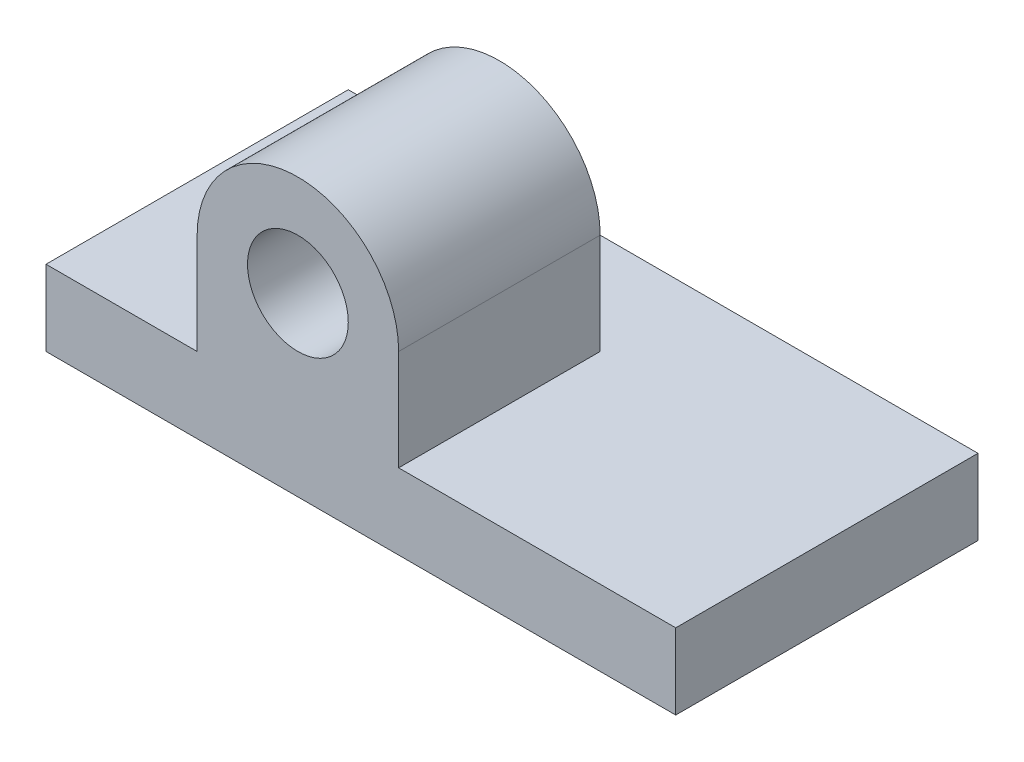
ISO-10303-21;
HEADER;
FILE_DESCRIPTION(('STEP AP214'),'2;1');
FILE_NAME('part.step','',(''),(''),'','','');
FILE_SCHEMA(('AUTOMOTIVE_DESIGN { 1 0 10303 214 1 1 1 1 }'));
ENDSEC;
DATA;
#1=APPLICATION_CONTEXT('core data for automotive mechanical design processes');
#2=APPLICATION_PROTOCOL_DEFINITION('international standard','automotive_design',2000,#1);
#3=PRODUCT_CONTEXT('',#1,'mechanical');
#4=PRODUCT('Part','Part','',(#3));
#5=PRODUCT_RELATED_PRODUCT_CATEGORY('part','',(#4));
#6=PRODUCT_DEFINITION_FORMATION('','',#4);
#7=PRODUCT_DEFINITION_CONTEXT('part definition',#1,'design');
#8=PRODUCT_DEFINITION('design','',#6,#7);
#9=PRODUCT_DEFINITION_SHAPE('','',#8);
#10=(LENGTH_UNIT() NAMED_UNIT(*) SI_UNIT(.MILLI.,.METRE.));
#11=(NAMED_UNIT(*) PLANE_ANGLE_UNIT() SI_UNIT($,.RADIAN.));
#12=(NAMED_UNIT(*) SI_UNIT($,.STERADIAN.) SOLID_ANGLE_UNIT());
#13=UNCERTAINTY_MEASURE_WITH_UNIT(LENGTH_MEASURE(1.E-05),#10,'distance_accuracy_value','');
#14=(GEOMETRIC_REPRESENTATION_CONTEXT(3) GLOBAL_UNCERTAINTY_ASSIGNED_CONTEXT((#13)) GLOBAL_UNIT_ASSIGNED_CONTEXT((#10,
#11,#12)) REPRESENTATION_CONTEXT('',''));
#15=CARTESIAN_POINT('',(0.,0.,0.));
#16=DIRECTION('',(0.,0.,1.));
#17=DIRECTION('',(1.,0.,0.));
#18=AXIS2_PLACEMENT_3D('',#15,#16,#17);
#19=CARTESIAN_POINT('',(30.,35.,-60.));
#20=DIRECTION('',(-1.,0.,0.));
#21=DIRECTION('',(0.,-1.,0.));
#22=AXIS2_PLACEMENT_3D('',#19,#20,#21);
#23=PLANE('',#22);
#24=DIRECTION('',(0.,0.,1.));
#25=VECTOR('',#24,1.);
#26=CARTESIAN_POINT('',(30.,35.,-60.));
#27=LINE('',#26,#25);
#28=CARTESIAN_POINT('',(30.,35.,-40.));
#29=VERTEX_POINT('',#28);
#30=CARTESIAN_POINT('',(30.,35.,0.));
#31=VERTEX_POINT('',#30);
#32=EDGE_CURVE('E148',#29,#31,#27,.T.);
#33=ORIENTED_EDGE('',*,*,#32,.F.);
#34=DIRECTION('',(0.,1.,0.));
#35=VECTOR('',#34,1.);
#36=CARTESIAN_POINT('',(30.,0.,-40.));
#37=LINE('',#36,#35);
#38=CARTESIAN_POINT('',(30.,15.,-40.));
#39=VERTEX_POINT('',#38);
#40=EDGE_CURVE('E126',#39,#29,#37,.T.);
#41=ORIENTED_EDGE('',*,*,#40,.F.);
#42=DIRECTION('',(0.,0.,1.));
#43=VECTOR('',#42,1.);
#44=CARTESIAN_POINT('',(30.,15.,-60.));
#45=LINE('',#44,#43);
#46=CARTESIAN_POINT('',(30.,15.,0.));
#47=VERTEX_POINT('',#46);
#48=EDGE_CURVE('E57',#39,#47,#45,.T.);
#49=ORIENTED_EDGE('',*,*,#48,.T.);
#50=DIRECTION('',(0.,-1.,0.));
#51=VECTOR('',#50,1.);
#52=CARTESIAN_POINT('',(30.,35.,0.));
#53=LINE('',#52,#51);
#54=EDGE_CURVE('E189',#31,#47,#53,.T.);
#55=ORIENTED_EDGE('',*,*,#54,.F.);
#56=EDGE_LOOP('',(#33,#41,#49,#55));
#57=FACE_BOUND('',#56,.T.);
#58=ADVANCED_FACE('F46',(#57),#23,.T.);
#59=CARTESIAN_POINT('',(50.,35.,-60.));
#60=DIRECTION('',(0.,0.,1.));
#61=DIRECTION('',(1.,0.,0.));
#62=AXIS2_PLACEMENT_3D('',#59,#60,#61);
#63=CYLINDRICAL_SURFACE('',#62,20.);
#64=DIRECTION('',(0.,0.,1.));
#65=VECTOR('',#64,1.);
#66=CARTESIAN_POINT('',(70.,35.,-60.));
#67=LINE('',#66,#65);
#68=CARTESIAN_POINT('',(70.,35.,-40.));
#69=VERTEX_POINT('',#68);
#70=CARTESIAN_POINT('',(70.,35.,0.));
#71=VERTEX_POINT('',#70);
#72=EDGE_CURVE('E143',#69,#71,#67,.T.);
#73=ORIENTED_EDGE('',*,*,#72,.F.);
#74=CARTESIAN_POINT('',(50.,35.,-40.));
#75=DIRECTION('',(0.,0.,-1.));
#76=DIRECTION('',(-1.,0.,0.));
#77=AXIS2_PLACEMENT_3D('',#74,#75,#76);
#78=CIRCLE('',#77,20.);
#79=EDGE_CURVE('E132',#29,#69,#78,.T.);
#80=ORIENTED_EDGE('',*,*,#79,.F.);
#81=ORIENTED_EDGE('',*,*,#32,.T.);
#82=CARTESIAN_POINT('',(50.,35.,0.));
#83=DIRECTION('',(0.,0.,1.));
#84=DIRECTION('',(1.,0.,0.));
#85=AXIS2_PLACEMENT_3D('',#82,#83,#84);
#86=CIRCLE('',#85,20.);
#87=EDGE_CURVE('E185',#71,#31,#86,.T.);
#88=ORIENTED_EDGE('',*,*,#87,.F.);
#89=EDGE_LOOP('',(#73,#80,#81,#88));
#90=FACE_BOUND('',#89,.T.);
#91=ADVANCED_FACE('F202',(#90),#63,.T.);
#92=CARTESIAN_POINT('',(70.,15.,-60.));
#93=DIRECTION('',(1.,0.,0.));
#94=DIRECTION('',(0.,0.,-1.));
#95=AXIS2_PLACEMENT_3D('',#92,#93,#94);
#96=PLANE('',#95);
#97=DIRECTION('',(0.,0.,1.));
#98=VECTOR('',#97,1.);
#99=CARTESIAN_POINT('',(70.,15.,-60.));
#100=LINE('',#99,#98);
#101=CARTESIAN_POINT('',(70.,15.,-40.));
#102=VERTEX_POINT('',#101);
#103=CARTESIAN_POINT('',(70.,15.,0.));
#104=VERTEX_POINT('',#103);
#105=EDGE_CURVE('E122',#102,#104,#100,.T.);
#106=ORIENTED_EDGE('',*,*,#105,.F.);
#107=DIRECTION('',(0.,-1.,0.));
#108=VECTOR('',#107,1.);
#109=CARTESIAN_POINT('',(70.,0.,-40.));
#110=LINE('',#109,#108);
#111=EDGE_CURVE('E127',#69,#102,#110,.T.);
#112=ORIENTED_EDGE('',*,*,#111,.F.);
#113=ORIENTED_EDGE('',*,*,#72,.T.);
#114=DIRECTION('',(0.,1.,0.));
#115=VECTOR('',#114,1.);
#116=CARTESIAN_POINT('',(70.,15.,0.));
#117=LINE('',#116,#115);
#118=EDGE_CURVE('E140',#104,#71,#117,.T.);
#119=ORIENTED_EDGE('',*,*,#118,.F.);
#120=EDGE_LOOP('',(#106,#112,#113,#119));
#121=FACE_BOUND('',#120,.T.);
#122=ADVANCED_FACE('F138',(#121),#96,.T.);
#123=CARTESIAN_POINT('',(50.,35.,-60.));
#124=DIRECTION('',(0.,0.,1.));
#125=DIRECTION('',(1.,0.,0.));
#126=AXIS2_PLACEMENT_3D('',#123,#124,#125);
#127=CYLINDRICAL_SURFACE('',#126,10.);
#128=CARTESIAN_POINT('',(50.,35.,0.));
#129=DIRECTION('',(0.,0.,1.));
#130=DIRECTION('',(1.,0.,0.));
#131=AXIS2_PLACEMENT_3D('',#128,#129,#130);
#132=CIRCLE('',#131,10.);
#133=CARTESIAN_POINT('',(60.,35.,0.));
#134=VERTEX_POINT('',#133);
#135=EDGE_CURVE('E172',#134,#134,#132,.T.);
#136=ORIENTED_EDGE('',*,*,#135,.T.);
#137=EDGE_LOOP('',(#136));
#138=FACE_BOUND('',#137,.T.);
#139=CARTESIAN_POINT('',(50.,35.,-40.));
#140=DIRECTION('',(0.,0.,-1.));
#141=DIRECTION('',(-1.,0.,0.));
#142=AXIS2_PLACEMENT_3D('',#139,#140,#141);
#143=CIRCLE('',#142,10.);
#144=CARTESIAN_POINT('',(40.,35.,-40.));
#145=VERTEX_POINT('',#144);
#146=EDGE_CURVE('E136',#145,#145,#143,.F.);
#147=ORIENTED_EDGE('',*,*,#146,.F.);
#148=EDGE_LOOP('',(#147));
#149=FACE_BOUND('',#148,.T.);
#150=ADVANCED_FACE('F229',(#138,#149),#127,.F.);
#151=CARTESIAN_POINT('',(0.,15.,-60.));
#152=DIRECTION('',(-1.,0.,0.));
#153=DIRECTION('',(0.,0.,1.));
#154=AXIS2_PLACEMENT_3D('',#151,#152,#153);
#155=PLANE('',#154);
#156=DIRECTION('',(0.,-1.,0.));
#157=VECTOR('',#156,1.);
#158=CARTESIAN_POINT('',(0.,15.,0.));
#159=LINE('',#158,#157);
#160=CARTESIAN_POINT('',(0.,15.,0.));
#161=VERTEX_POINT('',#160);
#162=CARTESIAN_POINT('',(0.,0.,0.));
#163=VERTEX_POINT('',#162);
#164=EDGE_CURVE('E167',#161,#163,#159,.T.);
#165=ORIENTED_EDGE('',*,*,#164,.F.);
#166=DIRECTION('',(0.,0.,1.));
#167=VECTOR('',#166,1.);
#168=CARTESIAN_POINT('',(0.,15.,-60.));
#169=LINE('',#168,#167);
#170=CARTESIAN_POINT('',(0.,15.,-60.));
#171=VERTEX_POINT('',#170);
#172=EDGE_CURVE('E12',#171,#161,#169,.T.);
#173=ORIENTED_EDGE('',*,*,#172,.F.);
#174=DIRECTION('',(0.,-1.,0.));
#175=VECTOR('',#174,1.);
#176=CARTESIAN_POINT('',(0.,15.,-60.));
#177=LINE('',#176,#175);
#178=CARTESIAN_POINT('',(0.,0.,-60.));
#179=VERTEX_POINT('',#178);
#180=EDGE_CURVE('E195',#171,#179,#177,.T.);
#181=ORIENTED_EDGE('',*,*,#180,.T.);
#182=DIRECTION('',(0.,0.,1.));
#183=VECTOR('',#182,1.);
#184=CARTESIAN_POINT('',(0.,0.,-60.));
#185=LINE('',#184,#183);
#186=EDGE_CURVE('E50',#179,#163,#185,.T.);
#187=ORIENTED_EDGE('',*,*,#186,.T.);
#188=EDGE_LOOP('',(#165,#173,#181,#187));
#189=FACE_BOUND('',#188,.T.);
#190=ADVANCED_FACE('F48',(#189),#155,.T.);
#191=CARTESIAN_POINT('',(30.,15.,-60.));
#192=DIRECTION('',(0.,1.,0.));
#193=DIRECTION('',(-1.,0.,0.));
#194=AXIS2_PLACEMENT_3D('',#191,#192,#193);
#195=PLANE('',#194);
#196=DIRECTION('',(-1.,0.,0.));
#197=VECTOR('',#196,1.);
#198=CARTESIAN_POINT('',(30.,15.,0.));
#199=LINE('',#198,#197);
#200=EDGE_CURVE('E192',#47,#161,#199,.T.);
#201=ORIENTED_EDGE('',*,*,#200,.F.);
#202=ORIENTED_EDGE('',*,*,#48,.F.);
#203=DIRECTION('',(-1.,0.,0.));
#204=VECTOR('',#203,1.);
#205=CARTESIAN_POINT('',(0.,15.,-40.));
#206=LINE('',#205,#204);
#207=EDGE_CURVE('E117',#102,#39,#206,.T.);
#208=ORIENTED_EDGE('',*,*,#207,.F.);
#209=ORIENTED_EDGE('',*,*,#105,.T.);
#210=DIRECTION('',(-1.,0.,0.));
#211=VECTOR('',#210,1.);
#212=CARTESIAN_POINT('',(125.,15.,0.));
#213=LINE('',#212,#211);
#214=CARTESIAN_POINT('',(125.,15.,0.));
#215=VERTEX_POINT('',#214);
#216=EDGE_CURVE('E180',#215,#104,#213,.T.);
#217=ORIENTED_EDGE('',*,*,#216,.F.);
#218=DIRECTION('',(0.,0.,1.));
#219=VECTOR('',#218,1.);
#220=CARTESIAN_POINT('',(125.,15.,-60.));
#221=LINE('',#220,#219);
#222=CARTESIAN_POINT('',(125.,15.,-60.));
#223=VERTEX_POINT('',#222);
#224=EDGE_CURVE('E144',#223,#215,#221,.T.);
#225=ORIENTED_EDGE('',*,*,#224,.F.);
#226=DIRECTION('',(-1.,0.,0.));
#227=VECTOR('',#226,1.);
#228=CARTESIAN_POINT('',(125.,15.,-60.));
#229=LINE('',#228,#227);
#230=EDGE_CURVE('E65',#223,#171,#229,.T.);
#231=ORIENTED_EDGE('',*,*,#230,.T.);
#232=ORIENTED_EDGE('',*,*,#172,.T.);
#233=EDGE_LOOP('',(#201,#202,#208,#209,#217,#225,#231,#232));
#234=FACE_BOUND('',#233,.T.);
#235=ADVANCED_FACE('F119',(#234),#195,.T.);
#236=CARTESIAN_POINT('',(125.,0.,-60.));
#237=DIRECTION('',(1.,0.,0.));
#238=DIRECTION('',(0.,0.,-1.));
#239=AXIS2_PLACEMENT_3D('',#236,#237,#238);
#240=PLANE('',#239);
#241=DIRECTION('',(0.,1.,0.));
#242=VECTOR('',#241,1.);
#243=CARTESIAN_POINT('',(125.,0.,0.));
#244=LINE('',#243,#242);
#245=CARTESIAN_POINT('',(125.,0.,0.));
#246=VERTEX_POINT('',#245);
#247=EDGE_CURVE('E176',#246,#215,#244,.T.);
#248=ORIENTED_EDGE('',*,*,#247,.F.);
#249=DIRECTION('',(0.,0.,1.));
#250=VECTOR('',#249,1.);
#251=CARTESIAN_POINT('',(125.,0.,-60.));
#252=LINE('',#251,#250);
#253=CARTESIAN_POINT('',(125.,0.,-60.));
#254=VERTEX_POINT('',#253);
#255=EDGE_CURVE('E150',#254,#246,#252,.T.);
#256=ORIENTED_EDGE('',*,*,#255,.F.);
#257=DIRECTION('',(0.,1.,0.));
#258=VECTOR('',#257,1.);
#259=CARTESIAN_POINT('',(125.,0.,-60.));
#260=LINE('',#259,#258);
#261=EDGE_CURVE('E159',#254,#223,#260,.T.);
#262=ORIENTED_EDGE('',*,*,#261,.T.);
#263=ORIENTED_EDGE('',*,*,#224,.T.);
#264=EDGE_LOOP('',(#248,#256,#262,#263));
#265=FACE_BOUND('',#264,.T.);
#266=ADVANCED_FACE('F210',(#265),#240,.T.);
#267=CARTESIAN_POINT('',(0.,0.,-60.));
#268=DIRECTION('',(0.,-1.,0.));
#269=DIRECTION('',(0.,0.,-1.));
#270=AXIS2_PLACEMENT_3D('',#267,#268,#269);
#271=PLANE('',#270);
#272=DIRECTION('',(1.,0.,0.));
#273=VECTOR('',#272,1.);
#274=CARTESIAN_POINT('',(0.,0.,0.));
#275=LINE('',#274,#273);
#276=EDGE_CURVE('E171',#163,#246,#275,.T.);
#277=ORIENTED_EDGE('',*,*,#276,.F.);
#278=ORIENTED_EDGE('',*,*,#186,.F.);
#279=DIRECTION('',(1.,0.,0.));
#280=VECTOR('',#279,1.);
#281=CARTESIAN_POINT('',(0.,0.,-60.));
#282=LINE('',#281,#280);
#283=EDGE_CURVE('E163',#179,#254,#282,.T.);
#284=ORIENTED_EDGE('',*,*,#283,.T.);
#285=ORIENTED_EDGE('',*,*,#255,.T.);
#286=EDGE_LOOP('',(#277,#278,#284,#285));
#287=FACE_BOUND('',#286,.T.);
#288=ADVANCED_FACE('F211',(#287),#271,.T.);
#289=CARTESIAN_POINT('',(50.,35.,-60.));
#290=DIRECTION('',(0.,0.,1.));
#291=DIRECTION('',(1.,0.,0.));
#292=AXIS2_PLACEMENT_3D('',#289,#290,#291);
#293=PLANE('',#292);
#294=ORIENTED_EDGE('',*,*,#180,.F.);
#295=ORIENTED_EDGE('',*,*,#230,.F.);
#296=ORIENTED_EDGE('',*,*,#261,.F.);
#297=ORIENTED_EDGE('',*,*,#283,.F.);
#298=EDGE_LOOP('',(#294,#295,#296,#297));
#299=FACE_BOUND('',#298,.T.);
#300=ADVANCED_FACE('F209',(#299),#293,.F.);
#301=CARTESIAN_POINT('',(50.,35.,0.));
#302=DIRECTION('',(0.,0.,1.));
#303=DIRECTION('',(1.,0.,0.));
#304=AXIS2_PLACEMENT_3D('',#301,#302,#303);
#305=PLANE('',#304);
#306=ORIENTED_EDGE('',*,*,#135,.F.);
#307=EDGE_LOOP('',(#306));
#308=FACE_BOUND('',#307,.T.);
#309=ORIENTED_EDGE('',*,*,#164,.T.);
#310=ORIENTED_EDGE('',*,*,#276,.T.);
#311=ORIENTED_EDGE('',*,*,#247,.T.);
#312=ORIENTED_EDGE('',*,*,#216,.T.);
#313=ORIENTED_EDGE('',*,*,#118,.T.);
#314=ORIENTED_EDGE('',*,*,#87,.T.);
#315=ORIENTED_EDGE('',*,*,#54,.T.);
#316=ORIENTED_EDGE('',*,*,#200,.T.);
#317=EDGE_LOOP('',(#309,#310,#311,#312,#313,#314,#315,#316));
#318=FACE_BOUND('',#317,.T.);
#319=ADVANCED_FACE('F204',(#308,#318),#305,.T.);
#320=CARTESIAN_POINT('',(0.,0.,-40.));
#321=DIRECTION('',(0.,0.,-1.));
#322=DIRECTION('',(-1.,0.,0.));
#323=AXIS2_PLACEMENT_3D('',#320,#321,#322);
#324=PLANE('',#323);
#325=ORIENTED_EDGE('',*,*,#146,.T.);
#326=EDGE_LOOP('',(#325));
#327=FACE_BOUND('',#326,.T.);
#328=ORIENTED_EDGE('',*,*,#111,.T.);
#329=ORIENTED_EDGE('',*,*,#207,.T.);
#330=ORIENTED_EDGE('',*,*,#40,.T.);
#331=ORIENTED_EDGE('',*,*,#79,.T.);
#332=EDGE_LOOP('',(#328,#329,#330,#331));
#333=FACE_BOUND('',#332,.T.);
#334=ADVANCED_FACE('F130',(#327,#333),#324,.T.);
#335=CLOSED_SHELL('',(#58,#91,#122,#150,#190,#235,#266,#288,#300,#319,#334));
#336=MANIFOLD_SOLID_BREP('B2',#335);
#337=ADVANCED_BREP_SHAPE_REPRESENTATION('',(#18,#336),#14);
#338=SHAPE_DEFINITION_REPRESENTATION(#9,#337);
ENDSEC;
END-ISO-10303-21;
